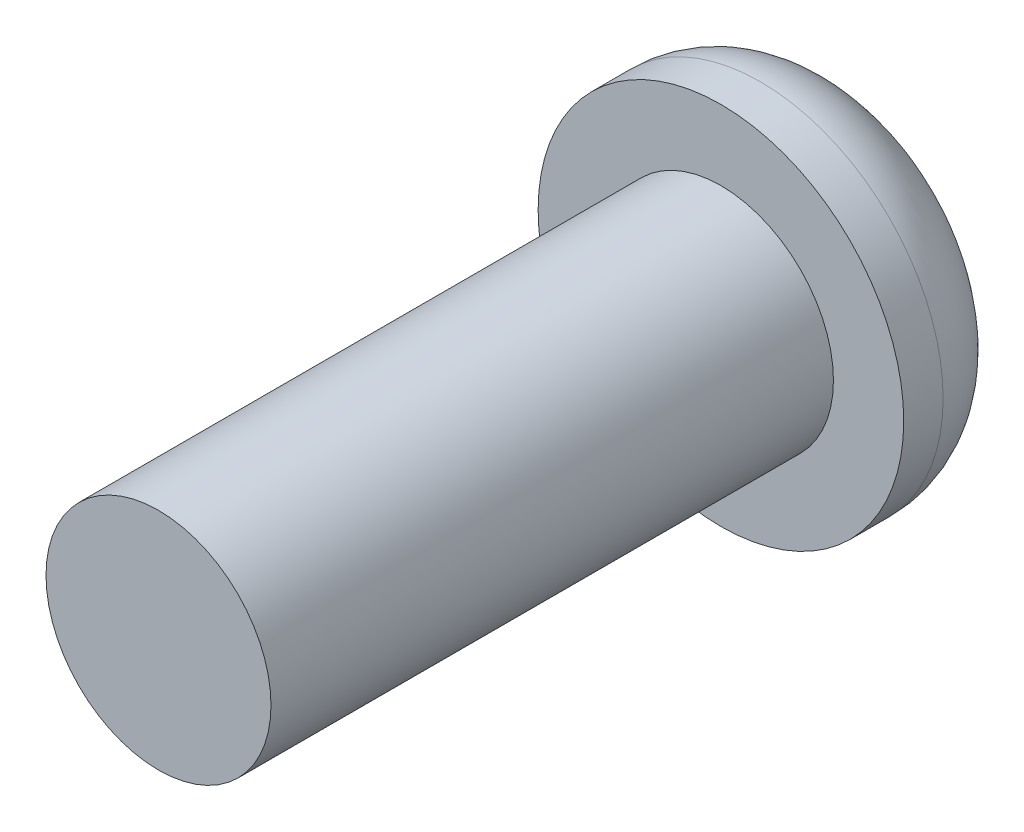
ISO-10303-21;
HEADER;
FILE_DESCRIPTION(('STEP AP214'),'2;1');
FILE_NAME('part.step','',(''),(''),'','','');
FILE_SCHEMA(('AUTOMOTIVE_DESIGN { 1 0 10303 214 1 1 1 1 }'));
ENDSEC;
DATA;
#1=APPLICATION_CONTEXT('core data for automotive mechanical design processes');
#2=APPLICATION_PROTOCOL_DEFINITION('international standard','automotive_design',2000,#1);
#3=PRODUCT_CONTEXT('',#1,'mechanical');
#4=PRODUCT('Part','Part','',(#3));
#5=PRODUCT_RELATED_PRODUCT_CATEGORY('part','',(#4));
#6=PRODUCT_DEFINITION_FORMATION('','',#4);
#7=PRODUCT_DEFINITION_CONTEXT('part definition',#1,'design');
#8=PRODUCT_DEFINITION('design','',#6,#7);
#9=PRODUCT_DEFINITION_SHAPE('','',#8);
#10=(LENGTH_UNIT() NAMED_UNIT(*) SI_UNIT(.MILLI.,.METRE.));
#11=(NAMED_UNIT(*) PLANE_ANGLE_UNIT() SI_UNIT($,.RADIAN.));
#12=(NAMED_UNIT(*) SI_UNIT($,.STERADIAN.) SOLID_ANGLE_UNIT());
#13=UNCERTAINTY_MEASURE_WITH_UNIT(LENGTH_MEASURE(1.E-05),#10,'distance_accuracy_value','');
#14=(GEOMETRIC_REPRESENTATION_CONTEXT(3) GLOBAL_UNCERTAINTY_ASSIGNED_CONTEXT((#13)) GLOBAL_UNIT_ASSIGNED_CONTEXT((#10,
#11,#12)) REPRESENTATION_CONTEXT('',''));
#15=CARTESIAN_POINT('',(0.,0.,0.));
#16=DIRECTION('',(0.,0.,1.));
#17=DIRECTION('',(1.,0.,0.));
#18=AXIS2_PLACEMENT_3D('',#15,#16,#17);
#19=CARTESIAN_POINT('',(0.,0.,10.));
#20=DIRECTION('',(0.,0.,-1.));
#21=DIRECTION('',(-1.,0.,0.));
#22=AXIS2_PLACEMENT_3D('',#19,#20,#21);
#23=CYLINDRICAL_SURFACE('',#22,2.);
#24=CARTESIAN_POINT('',(0.,0.,10.));
#25=DIRECTION('',(0.,0.,1.));
#26=DIRECTION('',(1.,0.,0.));
#27=AXIS2_PLACEMENT_3D('',#24,#25,#26);
#28=CIRCLE('',#27,2.);
#29=CARTESIAN_POINT('',(2.,0.,10.));
#30=VERTEX_POINT('',#29);
#31=EDGE_CURVE('E50',#30,#30,#28,.T.);
#32=ORIENTED_EDGE('',*,*,#31,.F.);
#33=EDGE_LOOP('',(#32));
#34=FACE_BOUND('',#33,.T.);
#35=CARTESIAN_POINT('',(0.,0.,0.));
#36=DIRECTION('',(0.,0.,1.));
#37=DIRECTION('',(1.,0.,0.));
#38=AXIS2_PLACEMENT_3D('',#35,#36,#37);
#39=CIRCLE('',#38,2.);
#40=CARTESIAN_POINT('',(2.,0.,0.));
#41=VERTEX_POINT('',#40);
#42=EDGE_CURVE('E55',#41,#41,#39,.T.);
#43=ORIENTED_EDGE('',*,*,#42,.T.);
#44=EDGE_LOOP('',(#43));
#45=FACE_BOUND('',#44,.T.);
#46=ADVANCED_FACE('F37',(#34,#45),#23,.T.);
#47=CARTESIAN_POINT('',(0.,0.,10.));
#48=DIRECTION('',(0.,0.,1.));
#49=DIRECTION('',(1.,0.,0.));
#50=AXIS2_PLACEMENT_3D('',#47,#48,#49);
#51=PLANE('',#50);
#52=ORIENTED_EDGE('',*,*,#31,.T.);
#53=EDGE_LOOP('',(#52));
#54=FACE_BOUND('',#53,.T.);
#55=ADVANCED_FACE('F82',(#54),#51,.T.);
#56=CARTESIAN_POINT('',(0.,0.,-2.2));
#57=DIRECTION('',(0.,0.,1.));
#58=DIRECTION('',(1.,0.,0.));
#59=AXIS2_PLACEMENT_3D('',#56,#57,#58);
#60=CYLINDRICAL_SURFACE('',#59,3.25);
#61=CARTESIAN_POINT('',(0.,0.,-0.7));
#62=DIRECTION('',(0.,0.,-1.));
#63=DIRECTION('',(-1.,0.,0.));
#64=AXIS2_PLACEMENT_3D('',#61,#62,#63);
#65=CIRCLE('',#64,3.25);
#66=CARTESIAN_POINT('',(-3.25,0.,-0.7));
#67=VERTEX_POINT('',#66);
#68=EDGE_CURVE('E10',#67,#67,#65,.F.);
#69=ORIENTED_EDGE('',*,*,#68,.T.);
#70=EDGE_LOOP('',(#69));
#71=FACE_BOUND('',#70,.T.);
#72=CARTESIAN_POINT('',(0.,0.,0.));
#73=DIRECTION('',(0.,0.,-1.));
#74=DIRECTION('',(-1.,0.,0.));
#75=AXIS2_PLACEMENT_3D('',#72,#73,#74);
#76=CIRCLE('',#75,3.25);
#77=CARTESIAN_POINT('',(-3.25,0.,0.));
#78=VERTEX_POINT('',#77);
#79=EDGE_CURVE('E60',#78,#78,#76,.T.);
#80=ORIENTED_EDGE('',*,*,#79,.T.);
#81=EDGE_LOOP('',(#80));
#82=FACE_BOUND('',#81,.T.);
#83=ADVANCED_FACE('F66',(#71,#82),#60,.T.);
#84=CARTESIAN_POINT('',(0.,0.,-2.2));
#85=DIRECTION('',(0.,0.,-1.));
#86=DIRECTION('',(-1.,0.,0.));
#87=AXIS2_PLACEMENT_3D('',#84,#85,#86);
#88=PLANE('',#87);
#89=CARTESIAN_POINT('',(0.,0.,-2.2));
#90=DIRECTION('',(0.,0.,-1.));
#91=DIRECTION('',(-1.,0.,0.));
#92=AXIS2_PLACEMENT_3D('',#89,#90,#91);
#93=CIRCLE('',#92,1.75);
#94=CARTESIAN_POINT('',(-1.75,0.,-2.2));
#95=VERTEX_POINT('',#94);
#96=EDGE_CURVE('E45',#95,#95,#93,.T.);
#97=ORIENTED_EDGE('',*,*,#96,.T.);
#98=EDGE_LOOP('',(#97));
#99=FACE_BOUND('',#98,.T.);
#100=ADVANCED_FACE('F70',(#99),#88,.T.);
#101=CARTESIAN_POINT('',(0.,0.,0.));
#102=DIRECTION('',(0.,0.,-1.));
#103=DIRECTION('',(-1.,0.,0.));
#104=AXIS2_PLACEMENT_3D('',#101,#102,#103);
#105=PLANE('',#104);
#106=ORIENTED_EDGE('',*,*,#42,.F.);
#107=EDGE_LOOP('',(#106));
#108=FACE_BOUND('',#107,.T.);
#109=ORIENTED_EDGE('',*,*,#79,.F.);
#110=EDGE_LOOP('',(#109));
#111=FACE_BOUND('',#110,.T.);
#112=ADVANCED_FACE('F68',(#108,#111),#105,.F.);
#113=CARTESIAN_POINT('',(0.,0.,-0.7));
#114=DIRECTION('',(0.,0.,-1.));
#115=DIRECTION('',(-1.,0.,0.));
#116=AXIS2_PLACEMENT_3D('',#113,#114,#115);
#117=TOROIDAL_SURFACE('',#116,1.75,1.5);
#118=ORIENTED_EDGE('',*,*,#68,.F.);
#119=EDGE_LOOP('',(#118));
#120=FACE_BOUND('',#119,.T.);
#121=ORIENTED_EDGE('',*,*,#96,.F.);
#122=EDGE_LOOP('',(#121));
#123=FACE_BOUND('',#122,.T.);
#124=ADVANCED_FACE('F39',(#120,#123),#117,.T.);
#125=CLOSED_SHELL('',(#46,#55,#83,#100,#112,#124));
#126=MANIFOLD_SOLID_BREP('B2',#125);
#127=ADVANCED_BREP_SHAPE_REPRESENTATION('',(#18,#126),#14);
#128=SHAPE_DEFINITION_REPRESENTATION(#9,#127);
ENDSEC;
END-ISO-10303-21;
